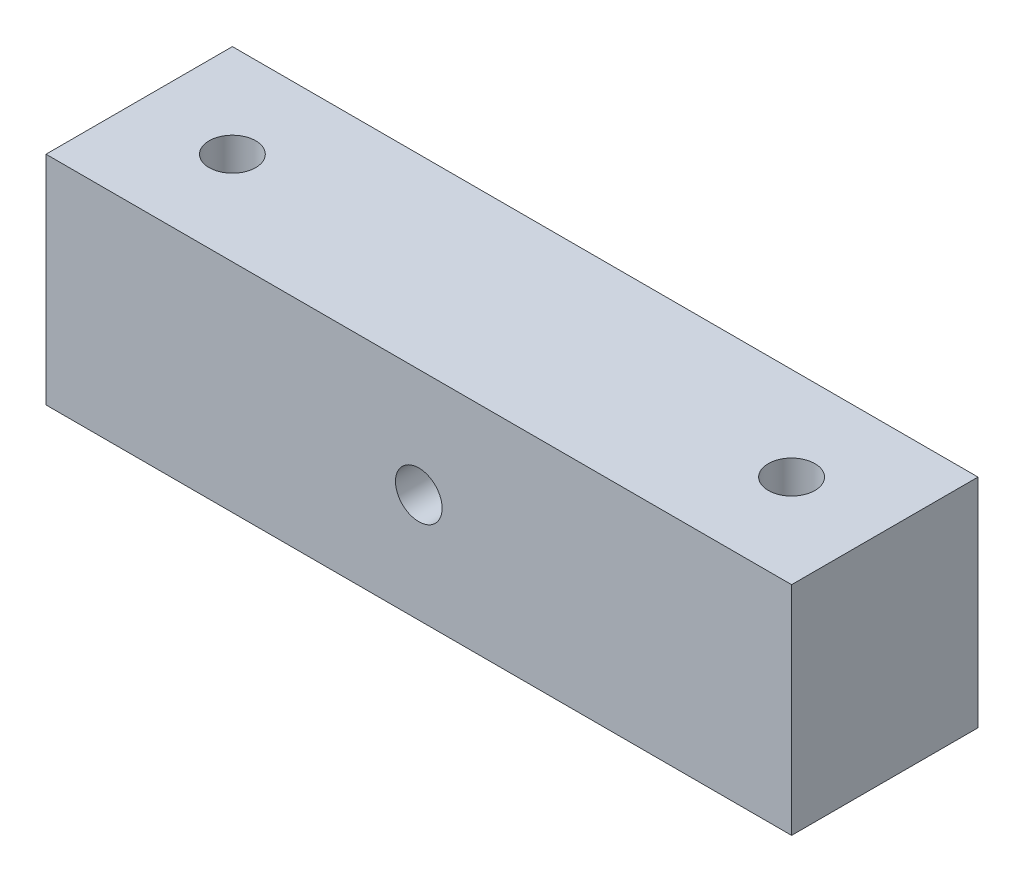
ISO-10303-21;
HEADER;
FILE_DESCRIPTION(('STEP AP214'),'2;1');
FILE_NAME('part.step','',(''),(''),'','','');
FILE_SCHEMA(('AUTOMOTIVE_DESIGN { 1 0 10303 214 1 1 1 1 }'));
ENDSEC;
DATA;
#1=APPLICATION_CONTEXT('core data for automotive mechanical design processes');
#2=APPLICATION_PROTOCOL_DEFINITION('international standard','automotive_design',2000,#1);
#3=PRODUCT_CONTEXT('',#1,'mechanical');
#4=PRODUCT('Part','Part','',(#3));
#5=PRODUCT_RELATED_PRODUCT_CATEGORY('part','',(#4));
#6=PRODUCT_DEFINITION_FORMATION('','',#4);
#7=PRODUCT_DEFINITION_CONTEXT('part definition',#1,'design');
#8=PRODUCT_DEFINITION('design','',#6,#7);
#9=PRODUCT_DEFINITION_SHAPE('','',#8);
#10=(LENGTH_UNIT() NAMED_UNIT(*) SI_UNIT(.MILLI.,.METRE.));
#11=(NAMED_UNIT(*) PLANE_ANGLE_UNIT() SI_UNIT($,.RADIAN.));
#12=(NAMED_UNIT(*) SI_UNIT($,.STERADIAN.) SOLID_ANGLE_UNIT());
#13=UNCERTAINTY_MEASURE_WITH_UNIT(LENGTH_MEASURE(1.E-05),#10,'distance_accuracy_value','');
#14=(GEOMETRIC_REPRESENTATION_CONTEXT(3) GLOBAL_UNCERTAINTY_ASSIGNED_CONTEXT((#13)) GLOBAL_UNIT_ASSIGNED_CONTEXT((#10,
#11,#12)) REPRESENTATION_CONTEXT('',''));
#15=CARTESIAN_POINT('',(0.,0.,0.));
#16=DIRECTION('',(0.,0.,1.));
#17=DIRECTION('',(1.,0.,0.));
#18=AXIS2_PLACEMENT_3D('',#15,#16,#17);
#19=CARTESIAN_POINT('',(0.,11.65,0.));
#20=DIRECTION('',(1.,0.,0.));
#21=DIRECTION('',(0.,0.,-1.));
#22=AXIS2_PLACEMENT_3D('',#19,#20,#21);
#23=PLANE('',#22);
#24=DIRECTION('',(0.,0.,1.));
#25=VECTOR('',#24,1.);
#26=CARTESIAN_POINT('',(0.,0.,0.));
#27=LINE('',#26,#25);
#28=CARTESIAN_POINT('',(0.,0.,-10.));
#29=VERTEX_POINT('',#28);
#30=CARTESIAN_POINT('',(0.,0.,0.));
#31=VERTEX_POINT('',#30);
#32=EDGE_CURVE('E98',#29,#31,#27,.T.);
#33=ORIENTED_EDGE('',*,*,#32,.T.);
#34=DIRECTION('',(0.,-1.,0.));
#35=VECTOR('',#34,1.);
#36=CARTESIAN_POINT('',(0.,11.65,0.));
#37=LINE('',#36,#35);
#38=CARTESIAN_POINT('',(0.,11.65,0.));
#39=VERTEX_POINT('',#38);
#40=EDGE_CURVE('E11',#39,#31,#37,.T.);
#41=ORIENTED_EDGE('',*,*,#40,.F.);
#42=DIRECTION('',(0.,0.,1.));
#43=VECTOR('',#42,1.);
#44=CARTESIAN_POINT('',(0.,11.65,0.));
#45=LINE('',#44,#43);
#46=CARTESIAN_POINT('',(0.,11.65,-10.));
#47=VERTEX_POINT('',#46);
#48=EDGE_CURVE('E86',#47,#39,#45,.T.);
#49=ORIENTED_EDGE('',*,*,#48,.F.);
#50=DIRECTION('',(0.,-1.,0.));
#51=VECTOR('',#50,1.);
#52=CARTESIAN_POINT('',(0.,11.65,-10.));
#53=LINE('',#52,#51);
#54=EDGE_CURVE('E94',#47,#29,#53,.T.);
#55=ORIENTED_EDGE('',*,*,#54,.T.);
#56=EDGE_LOOP('',(#33,#41,#49,#55));
#57=FACE_BOUND('',#56,.T.);
#58=ADVANCED_FACE('F35',(#57),#23,.F.);
#59=CARTESIAN_POINT('',(0.,11.65,0.));
#60=DIRECTION('',(0.,0.,-1.));
#61=DIRECTION('',(-1.,0.,0.));
#62=AXIS2_PLACEMENT_3D('',#59,#60,#61);
#63=PLANE('',#62);
#64=CARTESIAN_POINT('',(20.,5.825,0.));
#65=DIRECTION('',(0.,0.,-1.));
#66=DIRECTION('',(-1.,0.,0.));
#67=AXIS2_PLACEMENT_3D('',#64,#65,#66);
#68=CIRCLE('',#67,1.25);
#69=CARTESIAN_POINT('',(18.75,5.825,0.));
#70=VERTEX_POINT('',#69);
#71=EDGE_CURVE('E123',#70,#70,#68,.T.);
#72=ORIENTED_EDGE('',*,*,#71,.T.);
#73=EDGE_LOOP('',(#72));
#74=FACE_BOUND('',#73,.T.);
#75=DIRECTION('',(1.,0.,0.));
#76=VECTOR('',#75,1.);
#77=CARTESIAN_POINT('',(0.,0.,0.));
#78=LINE('',#77,#76);
#79=CARTESIAN_POINT('',(40.,0.,0.));
#80=VERTEX_POINT('',#79);
#81=EDGE_CURVE('E90',#31,#80,#78,.T.);
#82=ORIENTED_EDGE('',*,*,#81,.T.);
#83=DIRECTION('',(0.,-1.,0.));
#84=VECTOR('',#83,1.);
#85=CARTESIAN_POINT('',(40.,11.65,0.));
#86=LINE('',#85,#84);
#87=CARTESIAN_POINT('',(40.,11.65,0.));
#88=VERTEX_POINT('',#87);
#89=EDGE_CURVE('E43',#88,#80,#86,.T.);
#90=ORIENTED_EDGE('',*,*,#89,.F.);
#91=DIRECTION('',(1.,0.,0.));
#92=VECTOR('',#91,1.);
#93=CARTESIAN_POINT('',(0.,11.65,0.));
#94=LINE('',#93,#92);
#95=EDGE_CURVE('E81',#39,#88,#94,.T.);
#96=ORIENTED_EDGE('',*,*,#95,.F.);
#97=ORIENTED_EDGE('',*,*,#40,.T.);
#98=EDGE_LOOP('',(#82,#90,#96,#97));
#99=FACE_BOUND('',#98,.T.);
#100=ADVANCED_FACE('F89',(#74,#99),#63,.F.);
#101=CARTESIAN_POINT('',(40.,11.65,0.));
#102=DIRECTION('',(-1.,0.,0.));
#103=DIRECTION('',(0.,0.,1.));
#104=AXIS2_PLACEMENT_3D('',#101,#102,#103);
#105=PLANE('',#104);
#106=DIRECTION('',(0.,0.,-1.));
#107=VECTOR('',#106,1.);
#108=CARTESIAN_POINT('',(40.,0.,0.));
#109=LINE('',#108,#107);
#110=CARTESIAN_POINT('',(40.,0.,-10.));
#111=VERTEX_POINT('',#110);
#112=EDGE_CURVE('E68',#80,#111,#109,.T.);
#113=ORIENTED_EDGE('',*,*,#112,.T.);
#114=DIRECTION('',(0.,-1.,0.));
#115=VECTOR('',#114,1.);
#116=CARTESIAN_POINT('',(40.,11.65,-10.));
#117=LINE('',#116,#115);
#118=CARTESIAN_POINT('',(40.,11.65,-10.));
#119=VERTEX_POINT('',#118);
#120=EDGE_CURVE('E91',#119,#111,#117,.T.);
#121=ORIENTED_EDGE('',*,*,#120,.F.);
#122=DIRECTION('',(0.,0.,-1.));
#123=VECTOR('',#122,1.);
#124=CARTESIAN_POINT('',(40.,11.65,0.));
#125=LINE('',#124,#123);
#126=EDGE_CURVE('E84',#88,#119,#125,.T.);
#127=ORIENTED_EDGE('',*,*,#126,.F.);
#128=ORIENTED_EDGE('',*,*,#89,.T.);
#129=EDGE_LOOP('',(#113,#121,#127,#128));
#130=FACE_BOUND('',#129,.T.);
#131=ADVANCED_FACE('F92',(#130),#105,.F.);
#132=CARTESIAN_POINT('',(0.,11.65,-10.));
#133=DIRECTION('',(0.,0.,1.));
#134=DIRECTION('',(1.,0.,0.));
#135=AXIS2_PLACEMENT_3D('',#132,#133,#134);
#136=PLANE('',#135);
#137=CARTESIAN_POINT('',(20.,5.825,-10.));
#138=DIRECTION('',(0.,0.,-1.));
#139=DIRECTION('',(-1.,0.,0.));
#140=AXIS2_PLACEMENT_3D('',#137,#138,#139);
#141=CIRCLE('',#140,1.25);
#142=CARTESIAN_POINT('',(18.75,5.825,-10.));
#143=VERTEX_POINT('',#142);
#144=EDGE_CURVE('E126',#143,#143,#141,.T.);
#145=ORIENTED_EDGE('',*,*,#144,.F.);
#146=EDGE_LOOP('',(#145));
#147=FACE_BOUND('',#146,.T.);
#148=DIRECTION('',(-1.,0.,0.));
#149=VECTOR('',#148,1.);
#150=CARTESIAN_POINT('',(0.,0.,-10.));
#151=LINE('',#150,#149);
#152=EDGE_CURVE('E74',#111,#29,#151,.T.);
#153=ORIENTED_EDGE('',*,*,#152,.T.);
#154=ORIENTED_EDGE('',*,*,#54,.F.);
#155=DIRECTION('',(-1.,0.,0.));
#156=VECTOR('',#155,1.);
#157=CARTESIAN_POINT('',(0.,11.65,-10.));
#158=LINE('',#157,#156);
#159=EDGE_CURVE('E51',#119,#47,#158,.T.);
#160=ORIENTED_EDGE('',*,*,#159,.F.);
#161=ORIENTED_EDGE('',*,*,#120,.T.);
#162=EDGE_LOOP('',(#153,#154,#160,#161));
#163=FACE_BOUND('',#162,.T.);
#164=ADVANCED_FACE('F106',(#147,#163),#136,.F.);
#165=CARTESIAN_POINT('',(0.,11.65,0.));
#166=DIRECTION('',(0.,-1.,0.));
#167=DIRECTION('',(0.,0.,-1.));
#168=AXIS2_PLACEMENT_3D('',#165,#166,#167);
#169=PLANE('',#168);
#170=CARTESIAN_POINT('',(5.,11.65,-5.));
#171=DIRECTION('',(0.,1.,0.));
#172=DIRECTION('',(0.,0.,1.));
#173=AXIS2_PLACEMENT_3D('',#170,#171,#172);
#174=CIRCLE('',#173,1.25);
#175=CARTESIAN_POINT('',(5.,11.65,-3.75));
#176=VERTEX_POINT('',#175);
#177=EDGE_CURVE('E120',#176,#176,#174,.T.);
#178=ORIENTED_EDGE('',*,*,#177,.F.);
#179=EDGE_LOOP('',(#178));
#180=FACE_BOUND('',#179,.T.);
#181=CARTESIAN_POINT('',(35.,11.65,-5.));
#182=DIRECTION('',(0.,1.,0.));
#183=DIRECTION('',(0.,0.,1.));
#184=AXIS2_PLACEMENT_3D('',#181,#182,#183);
#185=CIRCLE('',#184,1.25);
#186=CARTESIAN_POINT('',(35.,11.65,-3.75));
#187=VERTEX_POINT('',#186);
#188=EDGE_CURVE('E114',#187,#187,#185,.T.);
#189=ORIENTED_EDGE('',*,*,#188,.F.);
#190=EDGE_LOOP('',(#189));
#191=FACE_BOUND('',#190,.T.);
#192=ORIENTED_EDGE('',*,*,#48,.T.);
#193=ORIENTED_EDGE('',*,*,#95,.T.);
#194=ORIENTED_EDGE('',*,*,#126,.T.);
#195=ORIENTED_EDGE('',*,*,#159,.T.);
#196=EDGE_LOOP('',(#192,#193,#194,#195));
#197=FACE_BOUND('',#196,.T.);
#198=ADVANCED_FACE('F82',(#180,#191,#197),#169,.F.);
#199=CARTESIAN_POINT('',(0.,0.,0.));
#200=DIRECTION('',(0.,-1.,0.));
#201=DIRECTION('',(0.,0.,-1.));
#202=AXIS2_PLACEMENT_3D('',#199,#200,#201);
#203=PLANE('',#202);
#204=CARTESIAN_POINT('',(5.,0.,-5.));
#205=DIRECTION('',(0.,1.,0.));
#206=DIRECTION('',(0.,0.,1.));
#207=AXIS2_PLACEMENT_3D('',#204,#205,#206);
#208=CIRCLE('',#207,1.25);
#209=CARTESIAN_POINT('',(5.,0.,-3.75));
#210=VERTEX_POINT('',#209);
#211=EDGE_CURVE('E117',#210,#210,#208,.T.);
#212=ORIENTED_EDGE('',*,*,#211,.T.);
#213=EDGE_LOOP('',(#212));
#214=FACE_BOUND('',#213,.T.);
#215=CARTESIAN_POINT('',(35.,0.,-5.));
#216=DIRECTION('',(0.,1.,0.));
#217=DIRECTION('',(0.,0.,1.));
#218=AXIS2_PLACEMENT_3D('',#215,#216,#217);
#219=CIRCLE('',#218,1.24999999999999);
#220=CARTESIAN_POINT('',(35.,0.,-3.75000000000001));
#221=VERTEX_POINT('',#220);
#222=EDGE_CURVE('E101',#221,#221,#219,.T.);
#223=ORIENTED_EDGE('',*,*,#222,.T.);
#224=EDGE_LOOP('',(#223));
#225=FACE_BOUND('',#224,.T.);
#226=ORIENTED_EDGE('',*,*,#32,.F.);
#227=ORIENTED_EDGE('',*,*,#152,.F.);
#228=ORIENTED_EDGE('',*,*,#112,.F.);
#229=ORIENTED_EDGE('',*,*,#81,.F.);
#230=EDGE_LOOP('',(#226,#227,#228,#229));
#231=FACE_BOUND('',#230,.T.);
#232=ADVANCED_FACE('F109',(#214,#225,#231),#203,.T.);
#233=CARTESIAN_POINT('',(35.,11.65,-5.));
#234=DIRECTION('',(0.,1.,0.));
#235=DIRECTION('',(0.,0.,1.));
#236=AXIS2_PLACEMENT_3D('',#233,#234,#235);
#237=CYLINDRICAL_SURFACE('',#236,1.25);
#238=ORIENTED_EDGE('',*,*,#222,.F.);
#239=EDGE_LOOP('',(#238));
#240=FACE_BOUND('',#239,.T.);
#241=ORIENTED_EDGE('',*,*,#188,.T.);
#242=EDGE_LOOP('',(#241));
#243=FACE_BOUND('',#242,.T.);
#244=ADVANCED_FACE('F157',(#240,#243),#237,.F.);
#245=CARTESIAN_POINT('',(5.,11.65,-5.));
#246=DIRECTION('',(0.,1.,0.));
#247=DIRECTION('',(0.,0.,1.));
#248=AXIS2_PLACEMENT_3D('',#245,#246,#247);
#249=CYLINDRICAL_SURFACE('',#248,1.25);
#250=ORIENTED_EDGE('',*,*,#211,.F.);
#251=EDGE_LOOP('',(#250));
#252=FACE_BOUND('',#251,.T.);
#253=ORIENTED_EDGE('',*,*,#177,.T.);
#254=EDGE_LOOP('',(#253));
#255=FACE_BOUND('',#254,.T.);
#256=ADVANCED_FACE('F152',(#252,#255),#249,.F.);
#257=CARTESIAN_POINT('',(20.,5.825,-10.));
#258=DIRECTION('',(0.,0.,-1.));
#259=DIRECTION('',(-1.,0.,0.));
#260=AXIS2_PLACEMENT_3D('',#257,#258,#259);
#261=CYLINDRICAL_SURFACE('',#260,1.25);
#262=ORIENTED_EDGE('',*,*,#71,.F.);
#263=EDGE_LOOP('',(#262));
#264=FACE_BOUND('',#263,.T.);
#265=ORIENTED_EDGE('',*,*,#144,.T.);
#266=EDGE_LOOP('',(#265));
#267=FACE_BOUND('',#266,.T.);
#268=ADVANCED_FACE('F130',(#264,#267),#261,.F.);
#269=CLOSED_SHELL('',(#58,#100,#131,#164,#198,#232,#244,#256,#268));
#270=MANIFOLD_SOLID_BREP('B2',#269);
#271=ADVANCED_BREP_SHAPE_REPRESENTATION('',(#18,#270),#14);
#272=SHAPE_DEFINITION_REPRESENTATION(#9,#271);
ENDSEC;
END-ISO-10303-21;
